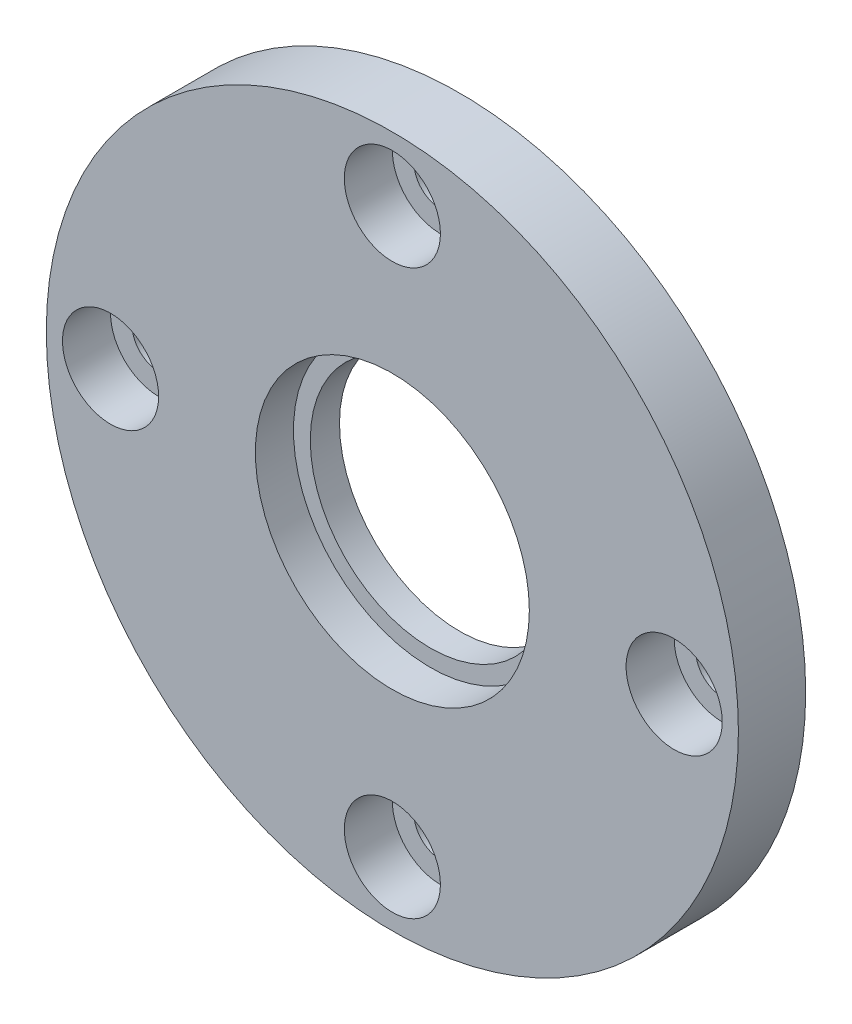
ISO-10303-21;
HEADER;
FILE_DESCRIPTION(('STEP AP214'),'2;1');
FILE_NAME('part.step','',(''),(''),'','','');
FILE_SCHEMA(('AUTOMOTIVE_DESIGN { 1 0 10303 214 1 1 1 1 }'));
ENDSEC;
DATA;
#1=APPLICATION_CONTEXT('core data for automotive mechanical design processes');
#2=APPLICATION_PROTOCOL_DEFINITION('international standard','automotive_design',2000,#1);
#3=PRODUCT_CONTEXT('',#1,'mechanical');
#4=PRODUCT('Part','Part','',(#3));
#5=PRODUCT_RELATED_PRODUCT_CATEGORY('part','',(#4));
#6=PRODUCT_DEFINITION_FORMATION('','',#4);
#7=PRODUCT_DEFINITION_CONTEXT('part definition',#1,'design');
#8=PRODUCT_DEFINITION('design','',#6,#7);
#9=PRODUCT_DEFINITION_SHAPE('','',#8);
#10=(LENGTH_UNIT() NAMED_UNIT(*) SI_UNIT(.MILLI.,.METRE.));
#11=(NAMED_UNIT(*) PLANE_ANGLE_UNIT() SI_UNIT($,.RADIAN.));
#12=(NAMED_UNIT(*) SI_UNIT($,.STERADIAN.) SOLID_ANGLE_UNIT());
#13=UNCERTAINTY_MEASURE_WITH_UNIT(LENGTH_MEASURE(1.E-05),#10,'distance_accuracy_value','');
#14=(GEOMETRIC_REPRESENTATION_CONTEXT(3) GLOBAL_UNCERTAINTY_ASSIGNED_CONTEXT((#13)) GLOBAL_UNIT_ASSIGNED_CONTEXT((#10,
#11,#12)) REPRESENTATION_CONTEXT('',''));
#15=CARTESIAN_POINT('',(0.,0.,0.));
#16=DIRECTION('',(0.,0.,1.));
#17=DIRECTION('',(1.,0.,0.));
#18=AXIS2_PLACEMENT_3D('',#15,#16,#17);
#19=CARTESIAN_POINT('',(0.,0.,142.659));
#20=DIRECTION('',(0.,0.,-1.));
#21=DIRECTION('',(-1.,0.,0.));
#22=AXIS2_PLACEMENT_3D('',#19,#20,#21);
#23=CYLINDRICAL_SURFACE('',#22,12.5);
#24=CARTESIAN_POINT('',(0.,0.,135.659));
#25=DIRECTION('',(0.,0.,-1.));
#26=DIRECTION('',(-1.,0.,0.));
#27=AXIS2_PLACEMENT_3D('',#24,#25,#26);
#28=CIRCLE('',#27,12.5);
#29=CARTESIAN_POINT('',(-12.5,0.,135.659));
#30=VERTEX_POINT('',#29);
#31=EDGE_CURVE('E45',#30,#30,#28,.T.);
#32=ORIENTED_EDGE('',*,*,#31,.T.);
#33=EDGE_LOOP('',(#32));
#34=FACE_BOUND('',#33,.T.);
#35=CARTESIAN_POINT('',(0.,0.,138.6966));
#36=DIRECTION('',(0.,0.,1.));
#37=DIRECTION('',(1.,0.,0.));
#38=AXIS2_PLACEMENT_3D('',#35,#36,#37);
#39=CIRCLE('',#38,12.5);
#40=CARTESIAN_POINT('',(12.5,0.,138.6966));
#41=VERTEX_POINT('',#40);
#42=EDGE_CURVE('E37',#41,#41,#39,.F.);
#43=ORIENTED_EDGE('',*,*,#42,.F.);
#44=EDGE_LOOP('',(#43));
#45=FACE_BOUND('',#44,.T.);
#46=ADVANCED_FACE('F33',(#34,#45),#23,.F.);
#47=CARTESIAN_POINT('',(0.,0.,1000.));
#48=DIRECTION('',(0.,0.,1.));
#49=DIRECTION('',(1.,0.,0.));
#50=AXIS2_PLACEMENT_3D('',#47,#48,#49);
#51=CYLINDRICAL_SURFACE('',#50,36.);
#52=CARTESIAN_POINT('',(0.,0.,142.659));
#53=DIRECTION('',(0.,0.,1.));
#54=DIRECTION('',(1.,0.,0.));
#55=AXIS2_PLACEMENT_3D('',#52,#53,#54);
#56=CIRCLE('',#55,36.);
#57=CARTESIAN_POINT('',(36.,0.,142.659));
#58=VERTEX_POINT('',#57);
#59=EDGE_CURVE('E10',#58,#58,#56,.T.);
#60=ORIENTED_EDGE('',*,*,#59,.F.);
#61=EDGE_LOOP('',(#60));
#62=FACE_BOUND('',#61,.T.);
#63=CARTESIAN_POINT('',(0.,0.,135.659));
#64=DIRECTION('',(0.,0.,1.));
#65=DIRECTION('',(1.,0.,0.));
#66=AXIS2_PLACEMENT_3D('',#63,#64,#65);
#67=CIRCLE('',#66,36.);
#68=CARTESIAN_POINT('',(36.,0.,135.659));
#69=VERTEX_POINT('',#68);
#70=EDGE_CURVE('E41',#69,#69,#67,.T.);
#71=ORIENTED_EDGE('',*,*,#70,.T.);
#72=EDGE_LOOP('',(#71));
#73=FACE_BOUND('',#72,.T.);
#74=ADVANCED_FACE('F35',(#62,#73),#51,.T.);
#75=CARTESIAN_POINT('',(0.,0.,142.659));
#76=DIRECTION('',(0.,0.,-1.));
#77=DIRECTION('',(-1.,0.,0.));
#78=AXIS2_PLACEMENT_3D('',#75,#76,#77);
#79=PLANE('',#78);
#80=CARTESIAN_POINT('',(0.,0.,142.659));
#81=DIRECTION('',(0.,0.,1.));
#82=DIRECTION('',(1.,0.,0.));
#83=AXIS2_PLACEMENT_3D('',#80,#81,#82);
#84=CIRCLE('',#83,14.25);
#85=CARTESIAN_POINT('',(14.25,0.,142.659));
#86=VERTEX_POINT('',#85);
#87=EDGE_CURVE('E98',#86,#86,#84,.T.);
#88=ORIENTED_EDGE('',*,*,#87,.F.);
#89=EDGE_LOOP('',(#88));
#90=FACE_BOUND('',#89,.T.);
#91=CARTESIAN_POINT('',(-29.3156,3.07064611010969E-13,142.659));
#92=DIRECTION('',(0.,0.,1.));
#93=DIRECTION('',(1.,0.,0.));
#94=AXIS2_PLACEMENT_3D('',#91,#92,#93);
#95=CIRCLE('',#94,5.);
#96=CARTESIAN_POINT('',(-24.3156,3.07064611010969E-13,142.659));
#97=VERTEX_POINT('',#96);
#98=EDGE_CURVE('E95',#97,#97,#95,.T.);
#99=ORIENTED_EDGE('',*,*,#98,.F.);
#100=EDGE_LOOP('',(#99));
#101=FACE_BOUND('',#100,.T.);
#102=CARTESIAN_POINT('',(0.,-29.3156,142.659));
#103=DIRECTION('',(0.,0.,1.));
#104=DIRECTION('',(1.,0.,0.));
#105=AXIS2_PLACEMENT_3D('',#102,#103,#104);
#106=CIRCLE('',#105,5.);
#107=CARTESIAN_POINT('',(5.,-29.3156,142.659));
#108=VERTEX_POINT('',#107);
#109=EDGE_CURVE('E83',#108,#108,#106,.T.);
#110=ORIENTED_EDGE('',*,*,#109,.F.);
#111=EDGE_LOOP('',(#110));
#112=FACE_BOUND('',#111,.T.);
#113=CARTESIAN_POINT('',(29.3156,-1.0235487033699E-13,142.659));
#114=DIRECTION('',(0.,0.,1.));
#115=DIRECTION('',(1.,0.,0.));
#116=AXIS2_PLACEMENT_3D('',#113,#114,#115);
#117=CIRCLE('',#116,5.);
#118=CARTESIAN_POINT('',(34.3156,-1.0235487033699E-13,142.659));
#119=VERTEX_POINT('',#118);
#120=EDGE_CURVE('E71',#119,#119,#117,.T.);
#121=ORIENTED_EDGE('',*,*,#120,.F.);
#122=EDGE_LOOP('',(#121));
#123=FACE_BOUND('',#122,.T.);
#124=CARTESIAN_POINT('',(0.,29.3156,142.659));
#125=DIRECTION('',(0.,0.,1.));
#126=DIRECTION('',(1.,0.,0.));
#127=AXIS2_PLACEMENT_3D('',#124,#125,#126);
#128=CIRCLE('',#127,5.);
#129=CARTESIAN_POINT('',(5.,29.3156,142.659));
#130=VERTEX_POINT('',#129);
#131=EDGE_CURVE('E59',#130,#130,#128,.T.);
#132=ORIENTED_EDGE('',*,*,#131,.F.);
#133=EDGE_LOOP('',(#132));
#134=FACE_BOUND('',#133,.T.);
#135=ORIENTED_EDGE('',*,*,#59,.T.);
#136=EDGE_LOOP('',(#135));
#137=FACE_BOUND('',#136,.T.);
#138=ADVANCED_FACE('F116',(#90,#101,#112,#123,#134,#137),#79,.F.);
#139=CARTESIAN_POINT('',(0.,0.,135.659));
#140=DIRECTION('',(0.,0.,-1.));
#141=DIRECTION('',(-1.,0.,0.));
#142=AXIS2_PLACEMENT_3D('',#139,#140,#141);
#143=PLANE('',#142);
#144=CARTESIAN_POINT('',(-29.3156,3.07064611010969E-13,135.659));
#145=DIRECTION('',(0.,0.,1.));
#146=DIRECTION('',(1.,0.,0.));
#147=AXIS2_PLACEMENT_3D('',#144,#145,#146);
#148=CIRCLE('',#147,2.75);
#149=CARTESIAN_POINT('',(-26.5656,3.07064611010969E-13,135.659));
#150=VERTEX_POINT('',#149);
#151=EDGE_CURVE('E86',#150,#150,#148,.T.);
#152=ORIENTED_EDGE('',*,*,#151,.T.);
#153=EDGE_LOOP('',(#152));
#154=FACE_BOUND('',#153,.T.);
#155=CARTESIAN_POINT('',(0.,-29.3156,135.659));
#156=DIRECTION('',(0.,0.,1.));
#157=DIRECTION('',(1.,0.,0.));
#158=AXIS2_PLACEMENT_3D('',#155,#156,#157);
#159=CIRCLE('',#158,2.75);
#160=CARTESIAN_POINT('',(2.75,-29.3156,135.659));
#161=VERTEX_POINT('',#160);
#162=EDGE_CURVE('E74',#161,#161,#159,.T.);
#163=ORIENTED_EDGE('',*,*,#162,.T.);
#164=EDGE_LOOP('',(#163));
#165=FACE_BOUND('',#164,.T.);
#166=CARTESIAN_POINT('',(29.3156,-1.0235487033699E-13,135.659));
#167=DIRECTION('',(0.,0.,1.));
#168=DIRECTION('',(1.,0.,0.));
#169=AXIS2_PLACEMENT_3D('',#166,#167,#168);
#170=CIRCLE('',#169,2.75);
#171=CARTESIAN_POINT('',(32.0656,-1.0235487033699E-13,135.659));
#172=VERTEX_POINT('',#171);
#173=EDGE_CURVE('E62',#172,#172,#170,.T.);
#174=ORIENTED_EDGE('',*,*,#173,.T.);
#175=EDGE_LOOP('',(#174));
#176=FACE_BOUND('',#175,.T.);
#177=CARTESIAN_POINT('',(0.,29.3156,135.659));
#178=DIRECTION('',(0.,0.,1.));
#179=DIRECTION('',(1.,0.,0.));
#180=AXIS2_PLACEMENT_3D('',#177,#178,#179);
#181=CIRCLE('',#180,2.75);
#182=CARTESIAN_POINT('',(2.75,29.3156,135.659));
#183=VERTEX_POINT('',#182);
#184=EDGE_CURVE('E50',#183,#183,#181,.T.);
#185=ORIENTED_EDGE('',*,*,#184,.T.);
#186=EDGE_LOOP('',(#185));
#187=FACE_BOUND('',#186,.T.);
#188=ORIENTED_EDGE('',*,*,#31,.F.);
#189=EDGE_LOOP('',(#188));
#190=FACE_BOUND('',#189,.T.);
#191=ORIENTED_EDGE('',*,*,#70,.F.);
#192=EDGE_LOOP('',(#191));
#193=FACE_BOUND('',#192,.T.);
#194=ADVANCED_FACE('F122',(#154,#165,#176,#187,#190,#193),#143,.T.);
#195=CARTESIAN_POINT('',(0.,29.3156,142.659));
#196=DIRECTION('',(0.,0.,1.));
#197=DIRECTION('',(1.,0.,0.));
#198=AXIS2_PLACEMENT_3D('',#195,#196,#197);
#199=CYLINDRICAL_SURFACE('',#198,2.75);
#200=ORIENTED_EDGE('',*,*,#184,.F.);
#201=EDGE_LOOP('',(#200));
#202=FACE_BOUND('',#201,.T.);
#203=CARTESIAN_POINT('',(0.,29.3156,137.659));
#204=DIRECTION('',(0.,0.,1.));
#205=DIRECTION('',(1.,0.,0.));
#206=AXIS2_PLACEMENT_3D('',#203,#204,#205);
#207=CIRCLE('',#206,2.75);
#208=CARTESIAN_POINT('',(2.75,29.3156,137.659));
#209=VERTEX_POINT('',#208);
#210=EDGE_CURVE('E53',#209,#209,#207,.T.);
#211=ORIENTED_EDGE('',*,*,#210,.T.);
#212=EDGE_LOOP('',(#211));
#213=FACE_BOUND('',#212,.T.);
#214=ADVANCED_FACE('F120',(#202,#213),#199,.F.);
#215=CARTESIAN_POINT('',(2.75,29.3156,137.659));
#216=DIRECTION('',(0.,0.,-1.));
#217=DIRECTION('',(-1.,0.,0.));
#218=AXIS2_PLACEMENT_3D('',#215,#216,#217);
#219=PLANE('',#218);
#220=ORIENTED_EDGE('',*,*,#210,.F.);
#221=EDGE_LOOP('',(#220));
#222=FACE_BOUND('',#221,.T.);
#223=CARTESIAN_POINT('',(0.,29.3156,137.659));
#224=DIRECTION('',(0.,0.,1.));
#225=DIRECTION('',(1.,0.,0.));
#226=AXIS2_PLACEMENT_3D('',#223,#224,#225);
#227=CIRCLE('',#226,5.);
#228=CARTESIAN_POINT('',(5.,29.3156,137.659));
#229=VERTEX_POINT('',#228);
#230=EDGE_CURVE('E56',#229,#229,#227,.T.);
#231=ORIENTED_EDGE('',*,*,#230,.T.);
#232=EDGE_LOOP('',(#231));
#233=FACE_BOUND('',#232,.T.);
#234=ADVANCED_FACE('F142',(#222,#233),#219,.F.);
#235=CARTESIAN_POINT('',(0.,29.3156,142.659));
#236=DIRECTION('',(0.,0.,1.));
#237=DIRECTION('',(1.,0.,0.));
#238=AXIS2_PLACEMENT_3D('',#235,#236,#237);
#239=CYLINDRICAL_SURFACE('',#238,5.);
#240=ORIENTED_EDGE('',*,*,#230,.F.);
#241=EDGE_LOOP('',(#240));
#242=FACE_BOUND('',#241,.T.);
#243=ORIENTED_EDGE('',*,*,#131,.T.);
#244=EDGE_LOOP('',(#243));
#245=FACE_BOUND('',#244,.T.);
#246=ADVANCED_FACE('F139',(#242,#245),#239,.F.);
#247=CARTESIAN_POINT('',(29.3156,-1.0235487033699E-13,142.659));
#248=DIRECTION('',(0.,0.,1.));
#249=DIRECTION('',(1.,0.,0.));
#250=AXIS2_PLACEMENT_3D('',#247,#248,#249);
#251=CYLINDRICAL_SURFACE('',#250,2.75);
#252=ORIENTED_EDGE('',*,*,#173,.F.);
#253=EDGE_LOOP('',(#252));
#254=FACE_BOUND('',#253,.T.);
#255=CARTESIAN_POINT('',(29.3156,-1.0235487033699E-13,137.659));
#256=DIRECTION('',(0.,0.,1.));
#257=DIRECTION('',(1.,0.,0.));
#258=AXIS2_PLACEMENT_3D('',#255,#256,#257);
#259=CIRCLE('',#258,2.75);
#260=CARTESIAN_POINT('',(32.0656,-1.0235487033699E-13,137.659));
#261=VERTEX_POINT('',#260);
#262=EDGE_CURVE('E65',#261,#261,#259,.T.);
#263=ORIENTED_EDGE('',*,*,#262,.T.);
#264=EDGE_LOOP('',(#263));
#265=FACE_BOUND('',#264,.T.);
#266=ADVANCED_FACE('F141',(#254,#265),#251,.F.);
#267=CARTESIAN_POINT('',(32.0656,-1.0235487033699E-13,137.659));
#268=DIRECTION('',(0.,0.,-1.));
#269=DIRECTION('',(-1.,0.,0.));
#270=AXIS2_PLACEMENT_3D('',#267,#268,#269);
#271=PLANE('',#270);
#272=ORIENTED_EDGE('',*,*,#262,.F.);
#273=EDGE_LOOP('',(#272));
#274=FACE_BOUND('',#273,.T.);
#275=CARTESIAN_POINT('',(29.3156,-1.0235487033699E-13,137.659));
#276=DIRECTION('',(0.,0.,1.));
#277=DIRECTION('',(1.,0.,0.));
#278=AXIS2_PLACEMENT_3D('',#275,#276,#277);
#279=CIRCLE('',#278,5.);
#280=CARTESIAN_POINT('',(34.3156,-1.0235487033699E-13,137.659));
#281=VERTEX_POINT('',#280);
#282=EDGE_CURVE('E68',#281,#281,#279,.T.);
#283=ORIENTED_EDGE('',*,*,#282,.T.);
#284=EDGE_LOOP('',(#283));
#285=FACE_BOUND('',#284,.T.);
#286=ADVANCED_FACE('F149',(#274,#285),#271,.F.);
#287=CARTESIAN_POINT('',(29.3156,-1.0235487033699E-13,142.659));
#288=DIRECTION('',(0.,0.,1.));
#289=DIRECTION('',(1.,0.,0.));
#290=AXIS2_PLACEMENT_3D('',#287,#288,#289);
#291=CYLINDRICAL_SURFACE('',#290,5.);
#292=ORIENTED_EDGE('',*,*,#282,.F.);
#293=EDGE_LOOP('',(#292));
#294=FACE_BOUND('',#293,.T.);
#295=ORIENTED_EDGE('',*,*,#120,.T.);
#296=EDGE_LOOP('',(#295));
#297=FACE_BOUND('',#296,.T.);
#298=ADVANCED_FACE('F157',(#294,#297),#291,.F.);
#299=CARTESIAN_POINT('',(0.,-29.3156,142.659));
#300=DIRECTION('',(0.,0.,1.));
#301=DIRECTION('',(1.,0.,0.));
#302=AXIS2_PLACEMENT_3D('',#299,#300,#301);
#303=CYLINDRICAL_SURFACE('',#302,2.75);
#304=ORIENTED_EDGE('',*,*,#162,.F.);
#305=EDGE_LOOP('',(#304));
#306=FACE_BOUND('',#305,.T.);
#307=CARTESIAN_POINT('',(0.,-29.3156,137.659));
#308=DIRECTION('',(0.,0.,1.));
#309=DIRECTION('',(1.,0.,0.));
#310=AXIS2_PLACEMENT_3D('',#307,#308,#309);
#311=CIRCLE('',#310,2.75);
#312=CARTESIAN_POINT('',(2.75,-29.3156,137.659));
#313=VERTEX_POINT('',#312);
#314=EDGE_CURVE('E77',#313,#313,#311,.T.);
#315=ORIENTED_EDGE('',*,*,#314,.T.);
#316=EDGE_LOOP('',(#315));
#317=FACE_BOUND('',#316,.T.);
#318=ADVANCED_FACE('F161',(#306,#317),#303,.F.);
#319=CARTESIAN_POINT('',(2.75,-29.3156,137.659));
#320=DIRECTION('',(0.,0.,-1.));
#321=DIRECTION('',(-1.,0.,0.));
#322=AXIS2_PLACEMENT_3D('',#319,#320,#321);
#323=PLANE('',#322);
#324=ORIENTED_EDGE('',*,*,#314,.F.);
#325=EDGE_LOOP('',(#324));
#326=FACE_BOUND('',#325,.T.);
#327=CARTESIAN_POINT('',(0.,-29.3156,137.659));
#328=DIRECTION('',(0.,0.,1.));
#329=DIRECTION('',(1.,0.,0.));
#330=AXIS2_PLACEMENT_3D('',#327,#328,#329);
#331=CIRCLE('',#330,5.);
#332=CARTESIAN_POINT('',(5.,-29.3156,137.659));
#333=VERTEX_POINT('',#332);
#334=EDGE_CURVE('E80',#333,#333,#331,.T.);
#335=ORIENTED_EDGE('',*,*,#334,.T.);
#336=EDGE_LOOP('',(#335));
#337=FACE_BOUND('',#336,.T.);
#338=ADVANCED_FACE('F165',(#326,#337),#323,.F.);
#339=CARTESIAN_POINT('',(0.,-29.3156,142.659));
#340=DIRECTION('',(0.,0.,1.));
#341=DIRECTION('',(1.,0.,0.));
#342=AXIS2_PLACEMENT_3D('',#339,#340,#341);
#343=CYLINDRICAL_SURFACE('',#342,5.);
#344=ORIENTED_EDGE('',*,*,#334,.F.);
#345=EDGE_LOOP('',(#344));
#346=FACE_BOUND('',#345,.T.);
#347=ORIENTED_EDGE('',*,*,#109,.T.);
#348=EDGE_LOOP('',(#347));
#349=FACE_BOUND('',#348,.T.);
#350=ADVANCED_FACE('F169',(#346,#349),#343,.F.);
#351=CARTESIAN_POINT('',(-29.3156,3.07064611010969E-13,142.659));
#352=DIRECTION('',(0.,0.,1.));
#353=DIRECTION('',(1.,0.,0.));
#354=AXIS2_PLACEMENT_3D('',#351,#352,#353);
#355=CYLINDRICAL_SURFACE('',#354,2.75);
#356=ORIENTED_EDGE('',*,*,#151,.F.);
#357=EDGE_LOOP('',(#356));
#358=FACE_BOUND('',#357,.T.);
#359=CARTESIAN_POINT('',(-29.3156,3.07064611010969E-13,137.659));
#360=DIRECTION('',(0.,0.,1.));
#361=DIRECTION('',(1.,0.,0.));
#362=AXIS2_PLACEMENT_3D('',#359,#360,#361);
#363=CIRCLE('',#362,2.75);
#364=CARTESIAN_POINT('',(-26.5656,3.07064611010969E-13,137.659));
#365=VERTEX_POINT('',#364);
#366=EDGE_CURVE('E89',#365,#365,#363,.T.);
#367=ORIENTED_EDGE('',*,*,#366,.T.);
#368=EDGE_LOOP('',(#367));
#369=FACE_BOUND('',#368,.T.);
#370=ADVANCED_FACE('F173',(#358,#369),#355,.F.);
#371=CARTESIAN_POINT('',(-26.5656,3.07064611010969E-13,137.659));
#372=DIRECTION('',(0.,0.,-1.));
#373=DIRECTION('',(-1.,0.,0.));
#374=AXIS2_PLACEMENT_3D('',#371,#372,#373);
#375=PLANE('',#374);
#376=ORIENTED_EDGE('',*,*,#366,.F.);
#377=EDGE_LOOP('',(#376));
#378=FACE_BOUND('',#377,.T.);
#379=CARTESIAN_POINT('',(-29.3156,3.07064611010969E-13,137.659));
#380=DIRECTION('',(0.,0.,1.));
#381=DIRECTION('',(1.,0.,0.));
#382=AXIS2_PLACEMENT_3D('',#379,#380,#381);
#383=CIRCLE('',#382,5.);
#384=CARTESIAN_POINT('',(-24.3156,3.07064611010969E-13,137.659));
#385=VERTEX_POINT('',#384);
#386=EDGE_CURVE('E92',#385,#385,#383,.T.);
#387=ORIENTED_EDGE('',*,*,#386,.T.);
#388=EDGE_LOOP('',(#387));
#389=FACE_BOUND('',#388,.T.);
#390=ADVANCED_FACE('F177',(#378,#389),#375,.F.);
#391=CARTESIAN_POINT('',(-29.3156,3.07064611010969E-13,142.659));
#392=DIRECTION('',(0.,0.,1.));
#393=DIRECTION('',(1.,0.,0.));
#394=AXIS2_PLACEMENT_3D('',#391,#392,#393);
#395=CYLINDRICAL_SURFACE('',#394,5.);
#396=ORIENTED_EDGE('',*,*,#386,.F.);
#397=EDGE_LOOP('',(#396));
#398=FACE_BOUND('',#397,.T.);
#399=ORIENTED_EDGE('',*,*,#98,.T.);
#400=EDGE_LOOP('',(#399));
#401=FACE_BOUND('',#400,.T.);
#402=ADVANCED_FACE('F181',(#398,#401),#395,.F.);
#403=CARTESIAN_POINT('',(0.,0.,138.6966));
#404=DIRECTION('',(0.,0.,1.));
#405=DIRECTION('',(1.,0.,0.));
#406=AXIS2_PLACEMENT_3D('',#403,#404,#405);
#407=PLANE('',#406);
#408=CARTESIAN_POINT('',(0.,0.,138.6966));
#409=DIRECTION('',(0.,0.,1.));
#410=DIRECTION('',(1.,0.,0.));
#411=AXIS2_PLACEMENT_3D('',#408,#409,#410);
#412=CIRCLE('',#411,14.25);
#413=CARTESIAN_POINT('',(14.25,0.,138.6966));
#414=VERTEX_POINT('',#413);
#415=EDGE_CURVE('E101',#414,#414,#412,.T.);
#416=ORIENTED_EDGE('',*,*,#415,.T.);
#417=EDGE_LOOP('',(#416));
#418=FACE_BOUND('',#417,.T.);
#419=ORIENTED_EDGE('',*,*,#42,.T.);
#420=EDGE_LOOP('',(#419));
#421=FACE_BOUND('',#420,.T.);
#422=ADVANCED_FACE('F108',(#418,#421),#407,.T.);
#423=CARTESIAN_POINT('',(0.,0.,138.6966));
#424=DIRECTION('',(0.,0.,1.));
#425=DIRECTION('',(1.,0.,0.));
#426=AXIS2_PLACEMENT_3D('',#423,#424,#425);
#427=CYLINDRICAL_SURFACE('',#426,14.25);
#428=ORIENTED_EDGE('',*,*,#415,.F.);
#429=EDGE_LOOP('',(#428));
#430=FACE_BOUND('',#429,.T.);
#431=ORIENTED_EDGE('',*,*,#87,.T.);
#432=EDGE_LOOP('',(#431));
#433=FACE_BOUND('',#432,.T.);
#434=ADVANCED_FACE('F186',(#430,#433),#427,.F.);
#435=CLOSED_SHELL('',(#46,#74,#138,#194,#214,#234,#246,#266,#286,#298,#318,#338,#350,#370,#390,
#402,#422,#434));
#436=MANIFOLD_SOLID_BREP('B2',#435);
#437=ADVANCED_BREP_SHAPE_REPRESENTATION('',(#18,#436),#14);
#438=SHAPE_DEFINITION_REPRESENTATION(#9,#437);
ENDSEC;
END-ISO-10303-21;
